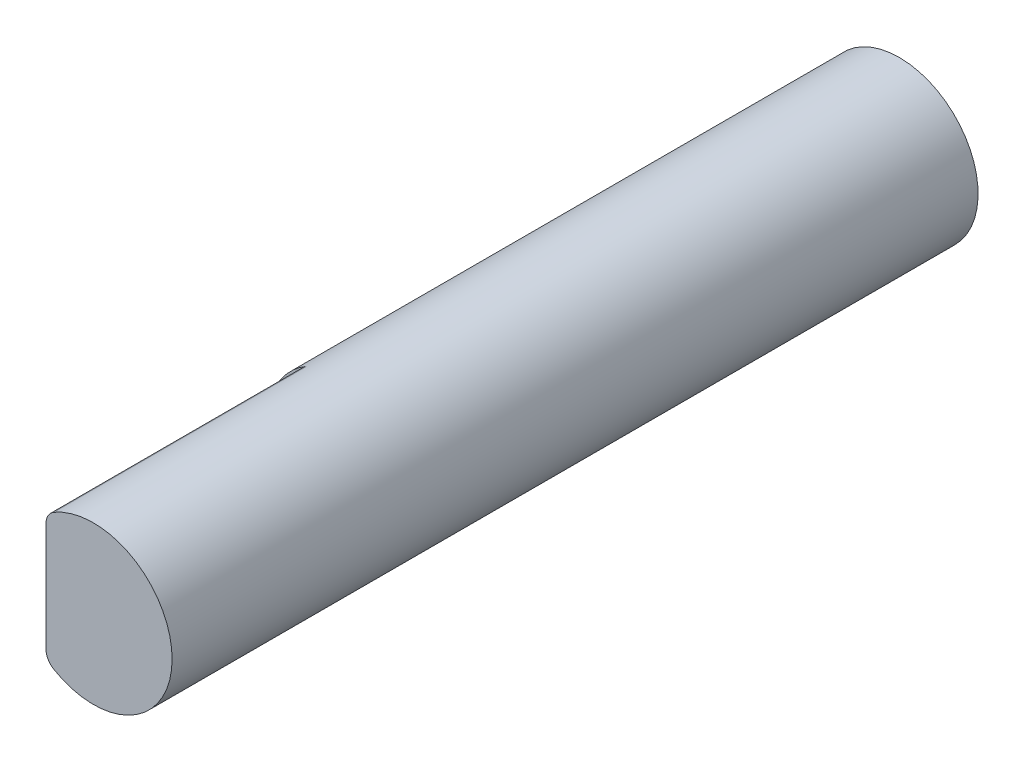
ISO-10303-21;
HEADER;
FILE_DESCRIPTION(('STEP AP214'),'2;1');
FILE_NAME('part.step','',(''),(''),'','','');
FILE_SCHEMA(('AUTOMOTIVE_DESIGN { 1 0 10303 214 1 1 1 1 }'));
ENDSEC;
DATA;
#1=APPLICATION_CONTEXT('core data for automotive mechanical design processes');
#2=APPLICATION_PROTOCOL_DEFINITION('international standard','automotive_design',2000,#1);
#3=PRODUCT_CONTEXT('',#1,'mechanical');
#4=PRODUCT('Part','Part','',(#3));
#5=PRODUCT_RELATED_PRODUCT_CATEGORY('part','',(#4));
#6=PRODUCT_DEFINITION_FORMATION('','',#4);
#7=PRODUCT_DEFINITION_CONTEXT('part definition',#1,'design');
#8=PRODUCT_DEFINITION('design','',#6,#7);
#9=PRODUCT_DEFINITION_SHAPE('','',#8);
#10=(LENGTH_UNIT() NAMED_UNIT(*) SI_UNIT(.MILLI.,.METRE.));
#11=(NAMED_UNIT(*) PLANE_ANGLE_UNIT() SI_UNIT($,.RADIAN.));
#12=(NAMED_UNIT(*) SI_UNIT($,.STERADIAN.) SOLID_ANGLE_UNIT());
#13=UNCERTAINTY_MEASURE_WITH_UNIT(LENGTH_MEASURE(1.E-05),#10,'distance_accuracy_value','');
#14=(GEOMETRIC_REPRESENTATION_CONTEXT(3) GLOBAL_UNCERTAINTY_ASSIGNED_CONTEXT((#13)) GLOBAL_UNIT_ASSIGNED_CONTEXT((#10,
#11,#12)) REPRESENTATION_CONTEXT('',''));
#15=CARTESIAN_POINT('',(0.,0.,0.));
#16=DIRECTION('',(0.,0.,1.));
#17=DIRECTION('',(1.,0.,0.));
#18=AXIS2_PLACEMENT_3D('',#15,#16,#17);
#19=CARTESIAN_POINT('',(0.,0.,-50.));
#20=DIRECTION('',(0.,0.,1.));
#21=DIRECTION('',(-1.,0.,0.));
#22=AXIS2_PLACEMENT_3D('',#19,#20,#21);
#23=CYLINDRICAL_SURFACE('',#22,4.98);
#24=CARTESIAN_POINT('',(0.,0.,-16.));
#25=DIRECTION('',(0.,0.,-1.));
#26=DIRECTION('',(-1.,0.,0.));
#27=AXIS2_PLACEMENT_3D('',#24,#25,#26);
#28=CIRCLE('',#27,4.98);
#29=CARTESIAN_POINT('',(-2.50251256281407,-4.30555813721726,-16.));
#30=VERTEX_POINT('',#29);
#31=CARTESIAN_POINT('',(-2.50251256281407,4.30555813721726,-16.));
#32=VERTEX_POINT('',#31);
#33=EDGE_CURVE('E177',#30,#32,#28,.T.);
#34=ORIENTED_EDGE('',*,*,#33,.T.);
#35=DIRECTION('',(0.,0.,1.));
#36=VECTOR('',#35,1.);
#37=CARTESIAN_POINT('',(-2.50251256281407,4.30555813721726,-50.));
#38=LINE('',#37,#36);
#39=CARTESIAN_POINT('',(-2.50251256281407,4.30555813721726,0.));
#40=VERTEX_POINT('',#39);
#41=EDGE_CURVE('E139',#40,#32,#38,.F.);
#42=ORIENTED_EDGE('',*,*,#41,.F.);
#43=CARTESIAN_POINT('',(0.,0.,0.));
#44=DIRECTION('',(0.,0.,1.));
#45=DIRECTION('',(1.,0.,0.));
#46=AXIS2_PLACEMENT_3D('',#43,#44,#45);
#47=CIRCLE('',#46,4.98);
#48=CARTESIAN_POINT('',(-2.50251256281407,-4.30555813721726,0.));
#49=VERTEX_POINT('',#48);
#50=EDGE_CURVE('E179',#49,#40,#47,.T.);
#51=ORIENTED_EDGE('',*,*,#50,.F.);
#52=DIRECTION('',(0.,0.,1.));
#53=VECTOR('',#52,1.);
#54=CARTESIAN_POINT('',(-2.50251256281407,-4.30555813721726,-50.));
#55=LINE('',#54,#53);
#56=EDGE_CURVE('E132',#30,#49,#55,.T.);
#57=ORIENTED_EDGE('',*,*,#56,.F.);
#58=EDGE_LOOP('',(#34,#42,#51,#57));
#59=FACE_BOUND('',#58,.T.);
#60=CARTESIAN_POINT('',(0.,0.,-34.));
#61=DIRECTION('',(0.,0.,1.));
#62=DIRECTION('',(1.,0.,0.));
#63=AXIS2_PLACEMENT_3D('',#60,#61,#62);
#64=CIRCLE('',#63,4.98);
#65=CARTESIAN_POINT('',(-3.74870290646182,3.27835728972372,-34.));
#66=VERTEX_POINT('',#65);
#67=CARTESIAN_POINT('',(-0.993145698642784,-4.87996532992473,-34.));
#68=VERTEX_POINT('',#67);
#69=EDGE_CURVE('E129',#66,#68,#64,.T.);
#70=ORIENTED_EDGE('',*,*,#69,.T.);
#71=DIRECTION('',(0.,0.,1.));
#72=VECTOR('',#71,1.);
#73=CARTESIAN_POINT('',(-0.993145698642784,-4.87996532992473,-50.));
#74=LINE('',#73,#72);
#75=CARTESIAN_POINT('',(-0.993145698642787,-4.87996532992472,-51.));
#76=VERTEX_POINT('',#75);
#77=EDGE_CURVE('E110',#76,#68,#74,.T.);
#78=ORIENTED_EDGE('',*,*,#77,.F.);
#79=CARTESIAN_POINT('',(0.,0.,-51.));
#80=DIRECTION('',(0.,0.,1.));
#81=DIRECTION('',(1.,0.,0.));
#82=AXIS2_PLACEMENT_3D('',#79,#80,#81);
#83=CIRCLE('',#82,4.98);
#84=CARTESIAN_POINT('',(-3.74870290646183,3.27835728972372,-51.));
#85=VERTEX_POINT('',#84);
#86=EDGE_CURVE('E118',#76,#85,#83,.T.);
#87=ORIENTED_EDGE('',*,*,#86,.T.);
#88=DIRECTION('',(0.,0.,1.));
#89=VECTOR('',#88,1.);
#90=CARTESIAN_POINT('',(-3.74870290646182,3.27835728972372,-50.));
#91=LINE('',#90,#89);
#92=EDGE_CURVE('E131',#66,#85,#91,.F.);
#93=ORIENTED_EDGE('',*,*,#92,.F.);
#94=EDGE_LOOP('',(#70,#78,#87,#93));
#95=FACE_BOUND('',#94,.T.);
#96=ADVANCED_FACE('F43',(#59,#95),#23,.T.);
#97=CARTESIAN_POINT('',(0.,0.,0.));
#98=DIRECTION('',(0.,0.,-1.));
#99=DIRECTION('',(1.,0.,0.));
#100=AXIS2_PLACEMENT_3D('',#97,#98,#99);
#101=PLANE('',#100);
#102=ORIENTED_EDGE('',*,*,#50,.T.);
#103=CARTESIAN_POINT('',(-2.,3.44098823014552,0.));
#104=DIRECTION('',(0.,0.,1.));
#105=DIRECTION('',(1.,0.,0.));
#106=AXIS2_PLACEMENT_3D('',#103,#104,#105);
#107=CIRCLE('',#106,1.);
#108=CARTESIAN_POINT('',(-3.,3.44098823014552,0.));
#109=VERTEX_POINT('',#108);
#110=EDGE_CURVE('E149',#109,#40,#107,.F.);
#111=ORIENTED_EDGE('',*,*,#110,.F.);
#112=DIRECTION('',(0.,-1.,0.));
#113=VECTOR('',#112,1.);
#114=CARTESIAN_POINT('',(-3.,0.,0.));
#115=LINE('',#114,#113);
#116=CARTESIAN_POINT('',(-3.,-3.44098823014552,0.));
#117=VERTEX_POINT('',#116);
#118=EDGE_CURVE('E183',#109,#117,#115,.T.);
#119=ORIENTED_EDGE('',*,*,#118,.T.);
#120=CARTESIAN_POINT('',(-2.,-3.44098823014552,0.));
#121=DIRECTION('',(0.,0.,1.));
#122=DIRECTION('',(1.,0.,0.));
#123=AXIS2_PLACEMENT_3D('',#120,#121,#122);
#124=CIRCLE('',#123,1.);
#125=EDGE_CURVE('E152',#49,#117,#124,.F.);
#126=ORIENTED_EDGE('',*,*,#125,.F.);
#127=EDGE_LOOP('',(#102,#111,#119,#126));
#128=FACE_BOUND('',#127,.T.);
#129=ADVANCED_FACE('F202',(#128),#101,.F.);
#130=CARTESIAN_POINT('',(-3.,0.,-16.));
#131=DIRECTION('',(1.,0.,0.));
#132=DIRECTION('',(0.,0.,1.));
#133=AXIS2_PLACEMENT_3D('',#130,#131,#132);
#134=PLANE('',#133);
#135=ORIENTED_EDGE('',*,*,#118,.F.);
#136=DIRECTION('',(0.,0.,1.));
#137=VECTOR('',#136,1.);
#138=CARTESIAN_POINT('',(-3.,3.44098823014552,-16.));
#139=LINE('',#138,#137);
#140=CARTESIAN_POINT('',(-3.,3.44098823014552,-16.));
#141=VERTEX_POINT('',#140);
#142=EDGE_CURVE('E156',#141,#109,#139,.T.);
#143=ORIENTED_EDGE('',*,*,#142,.F.);
#144=DIRECTION('',(0.,-1.,0.));
#145=VECTOR('',#144,1.);
#146=CARTESIAN_POINT('',(-3.,0.,-16.));
#147=LINE('',#146,#145);
#148=CARTESIAN_POINT('',(-3.,-3.44098823014552,-16.));
#149=VERTEX_POINT('',#148);
#150=EDGE_CURVE('E182',#141,#149,#147,.T.);
#151=ORIENTED_EDGE('',*,*,#150,.T.);
#152=DIRECTION('',(0.,0.,1.));
#153=VECTOR('',#152,1.);
#154=CARTESIAN_POINT('',(-3.,-3.44098823014552,-16.));
#155=LINE('',#154,#153);
#156=EDGE_CURVE('E159',#117,#149,#155,.F.);
#157=ORIENTED_EDGE('',*,*,#156,.F.);
#158=EDGE_LOOP('',(#135,#143,#151,#157));
#159=FACE_BOUND('',#158,.T.);
#160=ADVANCED_FACE('F204',(#159),#134,.F.);
#161=CARTESIAN_POINT('',(0.,0.,-16.));
#162=DIRECTION('',(0.,0.,1.));
#163=DIRECTION('',(-1.,0.,0.));
#164=AXIS2_PLACEMENT_3D('',#161,#162,#163);
#165=PLANE('',#164);
#166=ORIENTED_EDGE('',*,*,#33,.F.);
#167=CARTESIAN_POINT('',(-2.,-3.44098823014552,-16.));
#168=DIRECTION('',(0.,0.,-1.));
#169=DIRECTION('',(-1.,0.,0.));
#170=AXIS2_PLACEMENT_3D('',#167,#168,#169);
#171=CIRCLE('',#170,1.);
#172=EDGE_CURVE('E52',#149,#30,#171,.F.);
#173=ORIENTED_EDGE('',*,*,#172,.F.);
#174=ORIENTED_EDGE('',*,*,#150,.F.);
#175=CARTESIAN_POINT('',(-2.,3.44098823014552,-16.));
#176=DIRECTION('',(0.,0.,-1.));
#177=DIRECTION('',(-1.,0.,0.));
#178=AXIS2_PLACEMENT_3D('',#175,#176,#177);
#179=CIRCLE('',#178,1.);
#180=EDGE_CURVE('E11',#32,#141,#179,.F.);
#181=ORIENTED_EDGE('',*,*,#180,.F.);
#182=EDGE_LOOP('',(#166,#173,#174,#181));
#183=FACE_BOUND('',#182,.T.);
#184=ADVANCED_FACE('F180',(#183),#165,.T.);
#185=CARTESIAN_POINT('',(-2.84225262775848,-0.959999999999998,-34.));
#186=DIRECTION('',(-0.947417542586161,-0.319999999999999,0.));
#187=DIRECTION('',(0.319999999999999,-0.947417542586161,0.));
#188=AXIS2_PLACEMENT_3D('',#185,#186,#187);
#189=PLANE('',#188);
#190=DIRECTION('',(0.,0.,-1.));
#191=VECTOR('',#190,1.);
#192=CARTESIAN_POINT('',(-1.74113639411192,-4.22005261307237,-50.));
#193=LINE('',#192,#191);
#194=CARTESIAN_POINT('',(-1.74113639411192,-4.22005261307237,-34.));
#195=VERTEX_POINT('',#194);
#196=CARTESIAN_POINT('',(-1.74113639411192,-4.22005261307237,-51.));
#197=VERTEX_POINT('',#196);
#198=EDGE_CURVE('E113',#195,#197,#193,.T.);
#199=ORIENTED_EDGE('',*,*,#198,.F.);
#200=DIRECTION('',(0.319999999999999,-0.947417542586161,0.));
#201=VECTOR('',#200,1.);
#202=CARTESIAN_POINT('',(-2.84225262775848,-0.959999999999998,-34.));
#203=LINE('',#202,#201);
#204=CARTESIAN_POINT('',(-3.94336886140505,2.30005261307237,-34.));
#205=VERTEX_POINT('',#204);
#206=EDGE_CURVE('E246',#205,#195,#203,.T.);
#207=ORIENTED_EDGE('',*,*,#206,.F.);
#208=DIRECTION('',(0.,0.,-1.));
#209=VECTOR('',#208,1.);
#210=CARTESIAN_POINT('',(-3.94336886140505,2.30005261307237,-34.));
#211=LINE('',#210,#209);
#212=CARTESIAN_POINT('',(-3.94336886140505,2.30005261307237,-51.));
#213=VERTEX_POINT('',#212);
#214=EDGE_CURVE('E145',#213,#205,#211,.F.);
#215=ORIENTED_EDGE('',*,*,#214,.F.);
#216=DIRECTION('',(0.319999999999999,-0.947417542586161,0.));
#217=VECTOR('',#216,1.);
#218=CARTESIAN_POINT('',(-3.94336886140505,2.30005261307237,-51.));
#219=LINE('',#218,#217);
#220=EDGE_CURVE('E247',#213,#197,#219,.T.);
#221=ORIENTED_EDGE('',*,*,#220,.T.);
#222=EDGE_LOOP('',(#199,#207,#215,#221));
#223=FACE_BOUND('',#222,.T.);
#224=ADVANCED_FACE('F211',(#223),#189,.T.);
#225=CARTESIAN_POINT('',(0.,0.,-34.));
#226=DIRECTION('',(0.,0.,-1.));
#227=DIRECTION('',(1.,0.,0.));
#228=AXIS2_PLACEMENT_3D('',#225,#226,#227);
#229=PLANE('',#228);
#230=ORIENTED_EDGE('',*,*,#206,.T.);
#231=CARTESIAN_POINT('',(-0.793718851525759,-3.90005261307237,-34.));
#232=DIRECTION('',(0.,0.,1.));
#233=DIRECTION('',(1.,0.,0.));
#234=AXIS2_PLACEMENT_3D('',#231,#232,#233);
#235=CIRCLE('',#234,1.);
#236=EDGE_CURVE('E165',#68,#195,#235,.F.);
#237=ORIENTED_EDGE('',*,*,#236,.F.);
#238=ORIENTED_EDGE('',*,*,#69,.F.);
#239=CARTESIAN_POINT('',(-2.99595131881889,2.62005261307237,-34.));
#240=DIRECTION('',(0.,0.,1.));
#241=DIRECTION('',(1.,0.,0.));
#242=AXIS2_PLACEMENT_3D('',#239,#240,#241);
#243=CIRCLE('',#242,1.);
#244=EDGE_CURVE('E162',#205,#66,#243,.F.);
#245=ORIENTED_EDGE('',*,*,#244,.F.);
#246=EDGE_LOOP('',(#230,#237,#238,#245));
#247=FACE_BOUND('',#246,.T.);
#248=ADVANCED_FACE('F222',(#247),#229,.T.);
#249=CARTESIAN_POINT('',(-2.99595131881889,2.62005261307237,-50.));
#250=DIRECTION('',(0.,0.,1.));
#251=DIRECTION('',(-1.,0.,0.));
#252=AXIS2_PLACEMENT_3D('',#249,#250,#251);
#253=CYLINDRICAL_SURFACE('',#252,1.);
#254=ORIENTED_EDGE('',*,*,#244,.T.);
#255=ORIENTED_EDGE('',*,*,#92,.T.);
#256=CARTESIAN_POINT('',(-2.99595131881889,2.62005261307237,-51.));
#257=DIRECTION('',(0.,0.,1.));
#258=DIRECTION('',(1.,0.,0.));
#259=AXIS2_PLACEMENT_3D('',#256,#257,#258);
#260=CIRCLE('',#259,1.);
#261=EDGE_CURVE('E122',#85,#213,#260,.T.);
#262=ORIENTED_EDGE('',*,*,#261,.T.);
#263=ORIENTED_EDGE('',*,*,#214,.T.);
#264=EDGE_LOOP('',(#254,#255,#262,#263));
#265=FACE_BOUND('',#264,.T.);
#266=ADVANCED_FACE('F219',(#265),#253,.T.);
#267=CARTESIAN_POINT('',(-0.793718851525759,-3.90005261307237,-50.));
#268=DIRECTION('',(0.,0.,1.));
#269=DIRECTION('',(-1.,0.,0.));
#270=AXIS2_PLACEMENT_3D('',#267,#268,#269);
#271=CYLINDRICAL_SURFACE('',#270,1.);
#272=ORIENTED_EDGE('',*,*,#236,.T.);
#273=ORIENTED_EDGE('',*,*,#198,.T.);
#274=CARTESIAN_POINT('',(-0.793718851525759,-3.90005261307237,-51.));
#275=DIRECTION('',(0.,0.,1.));
#276=DIRECTION('',(1.,0.,0.));
#277=AXIS2_PLACEMENT_3D('',#274,#275,#276);
#278=CIRCLE('',#277,1.);
#279=EDGE_CURVE('E106',#197,#76,#278,.T.);
#280=ORIENTED_EDGE('',*,*,#279,.T.);
#281=ORIENTED_EDGE('',*,*,#77,.T.);
#282=EDGE_LOOP('',(#272,#273,#280,#281));
#283=FACE_BOUND('',#282,.T.);
#284=ADVANCED_FACE('F108',(#283),#271,.T.);
#285=CARTESIAN_POINT('',(-2.,-3.44098823014552,-50.));
#286=DIRECTION('',(0.,0.,1.));
#287=DIRECTION('',(-1.,0.,0.));
#288=AXIS2_PLACEMENT_3D('',#285,#286,#287);
#289=CYLINDRICAL_SURFACE('',#288,1.);
#290=ORIENTED_EDGE('',*,*,#172,.T.);
#291=ORIENTED_EDGE('',*,*,#56,.T.);
#292=ORIENTED_EDGE('',*,*,#125,.T.);
#293=ORIENTED_EDGE('',*,*,#156,.T.);
#294=EDGE_LOOP('',(#290,#291,#292,#293));
#295=FACE_BOUND('',#294,.T.);
#296=ADVANCED_FACE('F171',(#295),#289,.T.);
#297=CARTESIAN_POINT('',(-2.,3.44098823014552,-50.));
#298=DIRECTION('',(0.,0.,1.));
#299=DIRECTION('',(-1.,0.,0.));
#300=AXIS2_PLACEMENT_3D('',#297,#298,#299);
#301=CYLINDRICAL_SURFACE('',#300,1.);
#302=ORIENTED_EDGE('',*,*,#180,.T.);
#303=ORIENTED_EDGE('',*,*,#142,.T.);
#304=ORIENTED_EDGE('',*,*,#110,.T.);
#305=ORIENTED_EDGE('',*,*,#41,.T.);
#306=EDGE_LOOP('',(#302,#303,#304,#305));
#307=FACE_BOUND('',#306,.T.);
#308=ADVANCED_FACE('F45',(#307),#301,.T.);
#309=CARTESIAN_POINT('',(-0.793718851525759,-3.90005261307237,-51.));
#310=DIRECTION('',(0.,0.,-1.));
#311=DIRECTION('',(1.,0.,0.));
#312=AXIS2_PLACEMENT_3D('',#309,#310,#311);
#313=PLANE('',#312);
#314=ORIENTED_EDGE('',*,*,#279,.F.);
#315=ORIENTED_EDGE('',*,*,#220,.F.);
#316=ORIENTED_EDGE('',*,*,#261,.F.);
#317=ORIENTED_EDGE('',*,*,#86,.F.);
#318=EDGE_LOOP('',(#314,#315,#316,#317));
#319=FACE_BOUND('',#318,.T.);
#320=ADVANCED_FACE('F121',(#319),#313,.T.);
#321=CLOSED_SHELL('',(#96,#129,#160,#184,#224,#248,#266,#284,#296,#308,#320));
#322=MANIFOLD_SOLID_BREP('B2',#321);
#323=ADVANCED_BREP_SHAPE_REPRESENTATION('',(#18,#322),#14);
#324=SHAPE_DEFINITION_REPRESENTATION(#9,#323);
ENDSEC;
END-ISO-10303-21;
